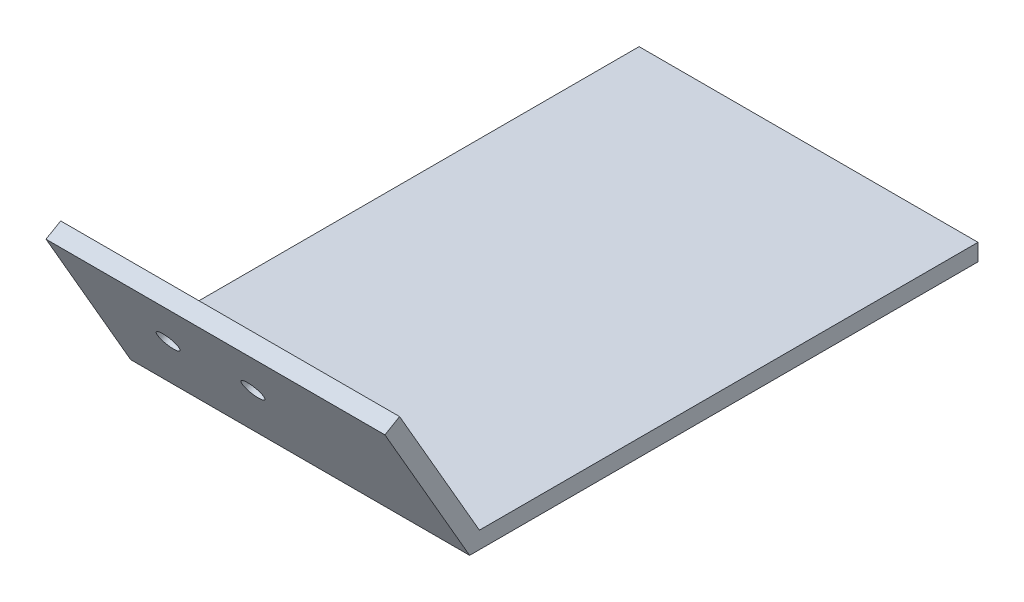
ISO-10303-21;
HEADER;
FILE_DESCRIPTION(('STEP AP214'),'2;1');
FILE_NAME('part.step','',(''),(''),'','','');
FILE_SCHEMA(('AUTOMOTIVE_DESIGN { 1 0 10303 214 1 1 1 1 }'));
ENDSEC;
DATA;
#1=APPLICATION_CONTEXT('core data for automotive mechanical design processes');
#2=APPLICATION_PROTOCOL_DEFINITION('international standard','automotive_design',2000,#1);
#3=PRODUCT_CONTEXT('',#1,'mechanical');
#4=PRODUCT('Part','Part','',(#3));
#5=PRODUCT_RELATED_PRODUCT_CATEGORY('part','',(#4));
#6=PRODUCT_DEFINITION_FORMATION('','',#4);
#7=PRODUCT_DEFINITION_CONTEXT('part definition',#1,'design');
#8=PRODUCT_DEFINITION('design','',#6,#7);
#9=PRODUCT_DEFINITION_SHAPE('','',#8);
#10=(LENGTH_UNIT() NAMED_UNIT(*) SI_UNIT(.MILLI.,.METRE.));
#11=(NAMED_UNIT(*) PLANE_ANGLE_UNIT() SI_UNIT($,.RADIAN.));
#12=(NAMED_UNIT(*) SI_UNIT($,.STERADIAN.) SOLID_ANGLE_UNIT());
#13=UNCERTAINTY_MEASURE_WITH_UNIT(LENGTH_MEASURE(1.E-05),#10,'distance_accuracy_value','');
#14=(GEOMETRIC_REPRESENTATION_CONTEXT(3) GLOBAL_UNCERTAINTY_ASSIGNED_CONTEXT((#13)) GLOBAL_UNIT_ASSIGNED_CONTEXT((#10,
#11,#12)) REPRESENTATION_CONTEXT('',''));
#15=CARTESIAN_POINT('',(0.,0.,0.));
#16=DIRECTION('',(0.,0.,1.));
#17=DIRECTION('',(1.,0.,0.));
#18=AXIS2_PLACEMENT_3D('',#15,#16,#17);
#19=CARTESIAN_POINT('',(100.,0.,-150.));
#20=DIRECTION('',(0.,1.,0.));
#21=DIRECTION('',(0.,0.,1.));
#22=AXIS2_PLACEMENT_3D('',#19,#20,#21);
#23=PLANE('',#22);
#24=DIRECTION('',(0.,0.,-1.));
#25=VECTOR('',#24,1.);
#26=CARTESIAN_POINT('',(0.,0.,-150.));
#27=LINE('',#26,#25);
#28=CARTESIAN_POINT('',(0.,0.,0.));
#29=VERTEX_POINT('',#28);
#30=CARTESIAN_POINT('',(0.,0.,-150.));
#31=VERTEX_POINT('',#30);
#32=EDGE_CURVE('E121',#29,#31,#27,.T.);
#33=ORIENTED_EDGE('',*,*,#32,.T.);
#34=DIRECTION('',(-1.,0.,0.));
#35=VECTOR('',#34,1.);
#36=CARTESIAN_POINT('',(100.,0.,-150.));
#37=LINE('',#36,#35);
#38=CARTESIAN_POINT('',(100.,0.,-150.));
#39=VERTEX_POINT('',#38);
#40=EDGE_CURVE('E11',#39,#31,#37,.T.);
#41=ORIENTED_EDGE('',*,*,#40,.F.);
#42=DIRECTION('',(0.,0.,-1.));
#43=VECTOR('',#42,1.);
#44=CARTESIAN_POINT('',(100.,0.,-150.));
#45=LINE('',#44,#43);
#46=CARTESIAN_POINT('',(100.,0.,0.));
#47=VERTEX_POINT('',#46);
#48=EDGE_CURVE('E132',#47,#39,#45,.T.);
#49=ORIENTED_EDGE('',*,*,#48,.F.);
#50=DIRECTION('',(-1.,0.,0.));
#51=VECTOR('',#50,1.);
#52=CARTESIAN_POINT('',(100.,0.,0.));
#53=LINE('',#52,#51);
#54=EDGE_CURVE('E117',#47,#29,#53,.T.);
#55=ORIENTED_EDGE('',*,*,#54,.T.);
#56=EDGE_LOOP('',(#33,#41,#49,#55));
#57=FACE_BOUND('',#56,.T.);
#58=ADVANCED_FACE('F35',(#57),#23,.F.);
#59=CARTESIAN_POINT('',(100.,4.99999999999999,-150.));
#60=DIRECTION('',(0.,0.,1.));
#61=DIRECTION('',(1.,0.,0.));
#62=AXIS2_PLACEMENT_3D('',#59,#60,#61);
#63=PLANE('',#62);
#64=DIRECTION('',(0.,1.,0.));
#65=VECTOR('',#64,1.);
#66=CARTESIAN_POINT('',(0.,4.99999999999999,-150.));
#67=LINE('',#66,#65);
#68=CARTESIAN_POINT('',(0.,4.99999999999999,-150.));
#69=VERTEX_POINT('',#68);
#70=EDGE_CURVE('E124',#31,#69,#67,.T.);
#71=ORIENTED_EDGE('',*,*,#70,.T.);
#72=DIRECTION('',(-1.,0.,0.));
#73=VECTOR('',#72,1.);
#74=CARTESIAN_POINT('',(100.,4.99999999999999,-150.));
#75=LINE('',#74,#73);
#76=CARTESIAN_POINT('',(100.,4.99999999999999,-150.));
#77=VERTEX_POINT('',#76);
#78=EDGE_CURVE('E44',#77,#69,#75,.T.);
#79=ORIENTED_EDGE('',*,*,#78,.F.);
#80=DIRECTION('',(0.,1.,0.));
#81=VECTOR('',#80,1.);
#82=CARTESIAN_POINT('',(100.,4.99999999999999,-150.));
#83=LINE('',#82,#81);
#84=EDGE_CURVE('E90',#39,#77,#83,.T.);
#85=ORIENTED_EDGE('',*,*,#84,.F.);
#86=ORIENTED_EDGE('',*,*,#40,.T.);
#87=EDGE_LOOP('',(#71,#79,#85,#86));
#88=FACE_BOUND('',#87,.T.);
#89=ADVANCED_FACE('F152',(#88),#63,.F.);
#90=CARTESIAN_POINT('',(100.,5.,-2.88675134594812));
#91=DIRECTION('',(0.,-1.,0.));
#92=DIRECTION('',(0.,0.,-1.));
#93=AXIS2_PLACEMENT_3D('',#90,#91,#92);
#94=PLANE('',#93);
#95=DIRECTION('',(0.,0.,1.));
#96=VECTOR('',#95,1.);
#97=CARTESIAN_POINT('',(0.,5.,-2.88675134594812));
#98=LINE('',#97,#96);
#99=CARTESIAN_POINT('',(0.,5.,-2.88675134594812));
#100=VERTEX_POINT('',#99);
#101=EDGE_CURVE('E127',#69,#100,#98,.T.);
#102=ORIENTED_EDGE('',*,*,#101,.T.);
#103=DIRECTION('',(-1.,0.,0.));
#104=VECTOR('',#103,1.);
#105=CARTESIAN_POINT('',(100.,5.,-2.88675134594812));
#106=LINE('',#105,#104);
#107=CARTESIAN_POINT('',(100.,5.,-2.88675134594812));
#108=VERTEX_POINT('',#107);
#109=EDGE_CURVE('E112',#108,#100,#106,.T.);
#110=ORIENTED_EDGE('',*,*,#109,.F.);
#111=DIRECTION('',(0.,0.,1.));
#112=VECTOR('',#111,1.);
#113=CARTESIAN_POINT('',(100.,5.,-2.88675134594812));
#114=LINE('',#113,#112);
#115=EDGE_CURVE('E103',#77,#108,#114,.T.);
#116=ORIENTED_EDGE('',*,*,#115,.F.);
#117=ORIENTED_EDGE('',*,*,#78,.T.);
#118=EDGE_LOOP('',(#102,#110,#116,#117));
#119=FACE_BOUND('',#118,.T.);
#120=ADVANCED_FACE('F155',(#119),#94,.F.);
#121=CARTESIAN_POINT('',(100.,45.801270189222,20.6698729810777));
#122=DIRECTION('',(0.,-0.499999999999998,0.86602540378444));
#123=DIRECTION('',(0.,-0.86602540378444,-0.499999999999998));
#124=AXIS2_PLACEMENT_3D('',#121,#122,#123);
#125=PLANE('',#124);
#126=CARTESIAN_POINT('',(25.,26.650635094611,9.61324865405185));
#127=DIRECTION('',(0.,0.499999999999998,-0.86602540378444));
#128=DIRECTION('',(0.,0.86602540378444,0.499999999999998));
#129=AXIS2_PLACEMENT_3D('',#126,#127,#128);
#130=CIRCLE('',#129,3.175);
#131=CARTESIAN_POINT('',(25.,29.4002657516266,11.2007486540518));
#132=VERTEX_POINT('',#131);
#133=EDGE_CURVE('E146',#132,#132,#130,.T.);
#134=ORIENTED_EDGE('',*,*,#133,.F.);
#135=EDGE_LOOP('',(#134));
#136=FACE_BOUND('',#135,.T.);
#137=CARTESIAN_POINT('',(50.,26.650635094611,9.61324865405185));
#138=DIRECTION('',(0.,0.499999999999998,-0.86602540378444));
#139=DIRECTION('',(0.,0.86602540378444,0.499999999999998));
#140=AXIS2_PLACEMENT_3D('',#137,#138,#139);
#141=CIRCLE('',#140,3.175);
#142=CARTESIAN_POINT('',(50.,29.4002657516266,11.2007486540518));
#143=VERTEX_POINT('',#142);
#144=EDGE_CURVE('E138',#143,#143,#141,.T.);
#145=ORIENTED_EDGE('',*,*,#144,.F.);
#146=EDGE_LOOP('',(#145));
#147=FACE_BOUND('',#146,.T.);
#148=DIRECTION('',(0.,0.86602540378444,0.499999999999998));
#149=VECTOR('',#148,1.);
#150=CARTESIAN_POINT('',(0.,45.801270189222,20.6698729810777));
#151=LINE('',#150,#149);
#152=CARTESIAN_POINT('',(0.,45.801270189222,20.6698729810777));
#153=VERTEX_POINT('',#152);
#154=EDGE_CURVE('E111',#100,#153,#151,.T.);
#155=ORIENTED_EDGE('',*,*,#154,.T.);
#156=DIRECTION('',(-1.,0.,0.));
#157=VECTOR('',#156,1.);
#158=CARTESIAN_POINT('',(100.,45.801270189222,20.6698729810777));
#159=LINE('',#158,#157);
#160=CARTESIAN_POINT('',(100.,45.801270189222,20.6698729810777));
#161=VERTEX_POINT('',#160);
#162=EDGE_CURVE('E108',#161,#153,#159,.T.);
#163=ORIENTED_EDGE('',*,*,#162,.F.);
#164=DIRECTION('',(0.,0.86602540378444,0.499999999999998));
#165=VECTOR('',#164,1.);
#166=CARTESIAN_POINT('',(100.,45.801270189222,20.6698729810777));
#167=LINE('',#166,#165);
#168=EDGE_CURVE('E97',#108,#161,#167,.T.);
#169=ORIENTED_EDGE('',*,*,#168,.F.);
#170=ORIENTED_EDGE('',*,*,#109,.T.);
#171=EDGE_LOOP('',(#155,#163,#169,#170));
#172=FACE_BOUND('',#171,.T.);
#173=ADVANCED_FACE('F109',(#136,#147,#172),#125,.F.);
#174=CARTESIAN_POINT('',(100.,43.301270189222,24.9999999999999));
#175=DIRECTION('',(0.,-0.866025403784439,-0.499999999999999));
#176=DIRECTION('',(0.,0.499999999999999,-0.866025403784439));
#177=AXIS2_PLACEMENT_3D('',#174,#175,#176);
#178=PLANE('',#177);
#179=DIRECTION('',(0.,-0.499999999999999,0.866025403784439));
#180=VECTOR('',#179,1.);
#181=CARTESIAN_POINT('',(0.,43.301270189222,24.9999999999999));
#182=LINE('',#181,#180);
#183=CARTESIAN_POINT('',(0.,43.301270189222,24.9999999999999));
#184=VERTEX_POINT('',#183);
#185=EDGE_CURVE('E76',#153,#184,#182,.T.);
#186=ORIENTED_EDGE('',*,*,#185,.T.);
#187=DIRECTION('',(-1.,0.,0.));
#188=VECTOR('',#187,1.);
#189=CARTESIAN_POINT('',(100.,43.301270189222,24.9999999999999));
#190=LINE('',#189,#188);
#191=CARTESIAN_POINT('',(100.,43.301270189222,24.9999999999999));
#192=VERTEX_POINT('',#191);
#193=EDGE_CURVE('E113',#192,#184,#190,.T.);
#194=ORIENTED_EDGE('',*,*,#193,.F.);
#195=DIRECTION('',(0.,-0.499999999999999,0.866025403784439));
#196=VECTOR('',#195,1.);
#197=CARTESIAN_POINT('',(100.,43.301270189222,24.9999999999999));
#198=LINE('',#197,#196);
#199=EDGE_CURVE('E101',#161,#192,#198,.T.);
#200=ORIENTED_EDGE('',*,*,#199,.F.);
#201=ORIENTED_EDGE('',*,*,#162,.T.);
#202=EDGE_LOOP('',(#186,#194,#200,#201));
#203=FACE_BOUND('',#202,.T.);
#204=ADVANCED_FACE('F115',(#203),#178,.F.);
#205=CARTESIAN_POINT('',(100.,0.,0.));
#206=DIRECTION('',(0.,0.499999999999998,-0.86602540378444));
#207=DIRECTION('',(0.,0.86602540378444,0.499999999999998));
#208=AXIS2_PLACEMENT_3D('',#205,#206,#207);
#209=PLANE('',#208);
#210=CARTESIAN_POINT('',(25.,24.150635094611,13.943375672974));
#211=DIRECTION('',(0.,0.499999999999998,-0.86602540378444));
#212=DIRECTION('',(0.,0.86602540378444,0.499999999999998));
#213=AXIS2_PLACEMENT_3D('',#210,#211,#212);
#214=CIRCLE('',#213,3.175);
#215=CARTESIAN_POINT('',(25.,26.9002657516266,15.530875672974));
#216=VERTEX_POINT('',#215);
#217=EDGE_CURVE('E38',#216,#216,#214,.T.);
#218=ORIENTED_EDGE('',*,*,#217,.T.);
#219=EDGE_LOOP('',(#218));
#220=FACE_BOUND('',#219,.T.);
#221=CARTESIAN_POINT('',(50.,24.150635094611,13.943375672974));
#222=DIRECTION('',(0.,0.499999999999998,-0.86602540378444));
#223=DIRECTION('',(0.,0.86602540378444,0.499999999999998));
#224=AXIS2_PLACEMENT_3D('',#221,#222,#223);
#225=CIRCLE('',#224,3.175);
#226=CARTESIAN_POINT('',(50.,26.9002657516266,15.530875672974));
#227=VERTEX_POINT('',#226);
#228=EDGE_CURVE('E125',#227,#227,#225,.T.);
#229=ORIENTED_EDGE('',*,*,#228,.T.);
#230=EDGE_LOOP('',(#229));
#231=FACE_BOUND('',#230,.T.);
#232=DIRECTION('',(0.,-0.86602540378444,-0.499999999999998));
#233=VECTOR('',#232,1.);
#234=CARTESIAN_POINT('',(0.,0.,0.));
#235=LINE('',#234,#233);
#236=EDGE_CURVE('E82',#184,#29,#235,.T.);
#237=ORIENTED_EDGE('',*,*,#236,.T.);
#238=ORIENTED_EDGE('',*,*,#54,.F.);
#239=DIRECTION('',(0.,-0.86602540378444,-0.499999999999998));
#240=VECTOR('',#239,1.);
#241=CARTESIAN_POINT('',(100.,0.,0.));
#242=LINE('',#241,#240);
#243=EDGE_CURVE('E53',#192,#47,#242,.T.);
#244=ORIENTED_EDGE('',*,*,#243,.F.);
#245=ORIENTED_EDGE('',*,*,#193,.T.);
#246=EDGE_LOOP('',(#237,#238,#244,#245));
#247=FACE_BOUND('',#246,.T.);
#248=ADVANCED_FACE('F160',(#220,#231,#247),#209,.F.);
#249=CARTESIAN_POINT('',(100.,0.,-150.));
#250=DIRECTION('',(1.,0.,0.));
#251=DIRECTION('',(0.,0.,-1.));
#252=AXIS2_PLACEMENT_3D('',#249,#250,#251);
#253=PLANE('',#252);
#254=ORIENTED_EDGE('',*,*,#48,.T.);
#255=ORIENTED_EDGE('',*,*,#84,.T.);
#256=ORIENTED_EDGE('',*,*,#115,.T.);
#257=ORIENTED_EDGE('',*,*,#168,.T.);
#258=ORIENTED_EDGE('',*,*,#199,.T.);
#259=ORIENTED_EDGE('',*,*,#243,.T.);
#260=EDGE_LOOP('',(#254,#255,#256,#257,#258,#259));
#261=FACE_BOUND('',#260,.T.);
#262=ADVANCED_FACE('F99',(#261),#253,.T.);
#263=CARTESIAN_POINT('',(0.,0.,-150.));
#264=DIRECTION('',(1.,0.,0.));
#265=DIRECTION('',(0.,0.,-1.));
#266=AXIS2_PLACEMENT_3D('',#263,#264,#265);
#267=PLANE('',#266);
#268=ORIENTED_EDGE('',*,*,#32,.F.);
#269=ORIENTED_EDGE('',*,*,#236,.F.);
#270=ORIENTED_EDGE('',*,*,#185,.F.);
#271=ORIENTED_EDGE('',*,*,#154,.F.);
#272=ORIENTED_EDGE('',*,*,#101,.F.);
#273=ORIENTED_EDGE('',*,*,#70,.F.);
#274=EDGE_LOOP('',(#268,#269,#270,#271,#272,#273));
#275=FACE_BOUND('',#274,.T.);
#276=ADVANCED_FACE('F158',(#275),#267,.F.);
#277=CARTESIAN_POINT('',(50.,13.3253175473056,32.693375672974));
#278=DIRECTION('',(0.,0.499999999999998,-0.86602540378444));
#279=DIRECTION('',(0.,0.86602540378444,0.499999999999998));
#280=AXIS2_PLACEMENT_3D('',#277,#278,#279);
#281=CYLINDRICAL_SURFACE('',#280,3.175);
#282=ORIENTED_EDGE('',*,*,#144,.T.);
#283=EDGE_LOOP('',(#282));
#284=FACE_BOUND('',#283,.T.);
#285=ORIENTED_EDGE('',*,*,#228,.F.);
#286=EDGE_LOOP('',(#285));
#287=FACE_BOUND('',#286,.T.);
#288=ADVANCED_FACE('F191',(#284,#287),#281,.F.);
#289=CARTESIAN_POINT('',(25.,13.3253175473056,32.693375672974));
#290=DIRECTION('',(0.,0.499999999999998,-0.86602540378444));
#291=DIRECTION('',(0.,0.86602540378444,0.499999999999998));
#292=AXIS2_PLACEMENT_3D('',#289,#290,#291);
#293=CYLINDRICAL_SURFACE('',#292,3.175);
#294=ORIENTED_EDGE('',*,*,#133,.T.);
#295=EDGE_LOOP('',(#294));
#296=FACE_BOUND('',#295,.T.);
#297=ORIENTED_EDGE('',*,*,#217,.F.);
#298=EDGE_LOOP('',(#297));
#299=FACE_BOUND('',#298,.T.);
#300=ADVANCED_FACE('F188',(#296,#299),#293,.F.);
#301=CLOSED_SHELL('',(#58,#89,#120,#173,#204,#248,#262,#276,#288,#300));
#302=MANIFOLD_SOLID_BREP('B2',#301);
#303=ADVANCED_BREP_SHAPE_REPRESENTATION('',(#18,#302),#14);
#304=SHAPE_DEFINITION_REPRESENTATION(#9,#303);
ENDSEC;
END-ISO-10303-21;
